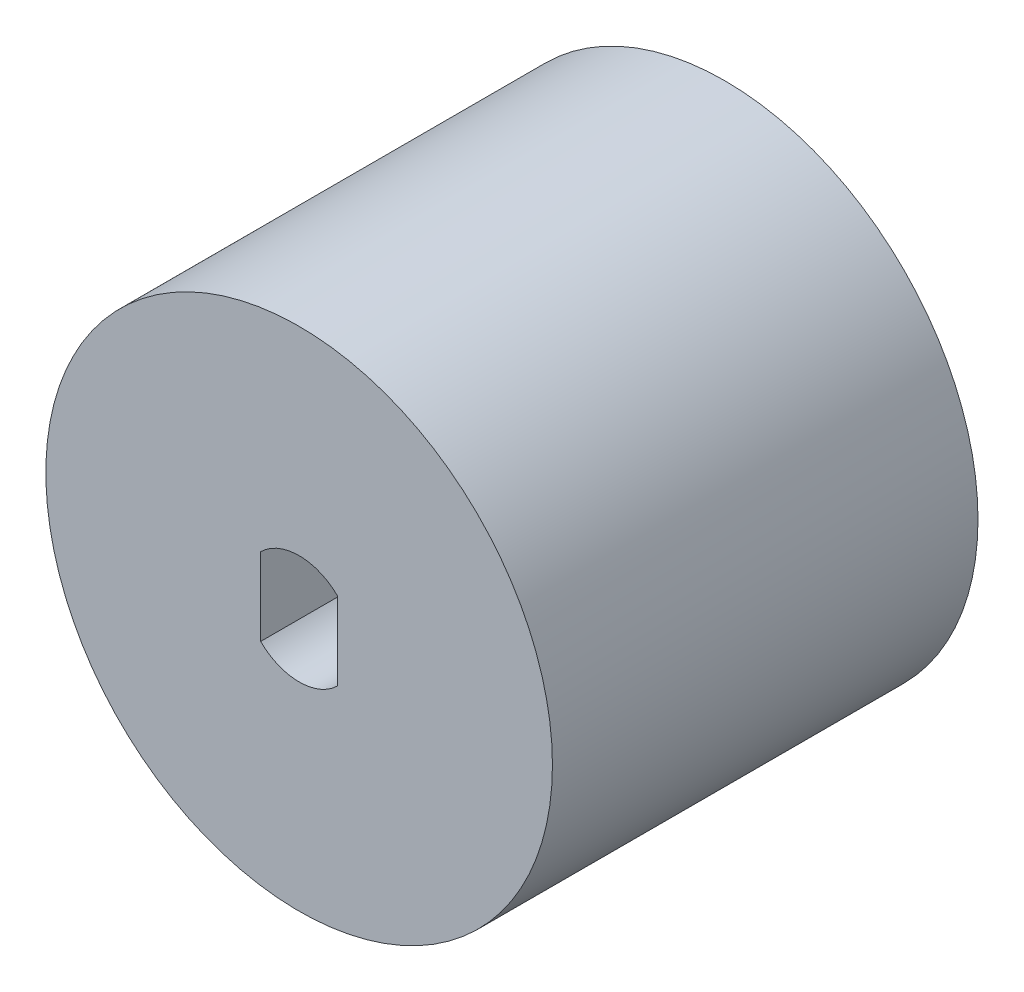
ISO-10303-21;
HEADER;
FILE_DESCRIPTION(('STEP AP214'),'2;1');
FILE_NAME('part.step','',(''),(''),'','','');
FILE_SCHEMA(('AUTOMOTIVE_DESIGN { 1 0 10303 214 1 1 1 1 }'));
ENDSEC;
DATA;
#1=APPLICATION_CONTEXT('core data for automotive mechanical design processes');
#2=APPLICATION_PROTOCOL_DEFINITION('international standard','automotive_design',2000,#1);
#3=PRODUCT_CONTEXT('',#1,'mechanical');
#4=PRODUCT('Part','Part','',(#3));
#5=PRODUCT_RELATED_PRODUCT_CATEGORY('part','',(#4));
#6=PRODUCT_DEFINITION_FORMATION('','',#4);
#7=PRODUCT_DEFINITION_CONTEXT('part definition',#1,'design');
#8=PRODUCT_DEFINITION('design','',#6,#7);
#9=PRODUCT_DEFINITION_SHAPE('','',#8);
#10=(LENGTH_UNIT() NAMED_UNIT(*) SI_UNIT(.MILLI.,.METRE.));
#11=(NAMED_UNIT(*) PLANE_ANGLE_UNIT() SI_UNIT($,.RADIAN.));
#12=(NAMED_UNIT(*) SI_UNIT($,.STERADIAN.) SOLID_ANGLE_UNIT());
#13=UNCERTAINTY_MEASURE_WITH_UNIT(LENGTH_MEASURE(1.E-05),#10,'distance_accuracy_value','');
#14=(GEOMETRIC_REPRESENTATION_CONTEXT(3) GLOBAL_UNCERTAINTY_ASSIGNED_CONTEXT((#13)) GLOBAL_UNIT_ASSIGNED_CONTEXT((#10,
#11,#12)) REPRESENTATION_CONTEXT('',''));
#15=CARTESIAN_POINT('',(0.,0.,0.));
#16=DIRECTION('',(0.,0.,1.));
#17=DIRECTION('',(1.,0.,0.));
#18=AXIS2_PLACEMENT_3D('',#15,#16,#17);
#19=CARTESIAN_POINT('',(0.,0.,-6.));
#20=DIRECTION('',(0.,0.,-1.));
#21=DIRECTION('',(-1.,0.,0.));
#22=AXIS2_PLACEMENT_3D('',#19,#20,#21);
#23=PLANE('',#22);
#24=CARTESIAN_POINT('',(0.,0.,-6.));
#25=DIRECTION('',(0.,0.,-1.));
#26=DIRECTION('',(-1.,0.,0.));
#27=AXIS2_PLACEMENT_3D('',#24,#25,#26);
#28=CIRCLE('',#27,1.);
#29=CARTESIAN_POINT('',(-1.,0.,-6.));
#30=VERTEX_POINT('',#29);
#31=EDGE_CURVE('E134',#30,#30,#28,.T.);
#32=ORIENTED_EDGE('',*,*,#31,.F.);
#33=EDGE_LOOP('',(#32));
#34=FACE_BOUND('',#33,.T.);
#35=CARTESIAN_POINT('',(0.,0.,-6.));
#36=DIRECTION('',(0.,0.,-1.));
#37=DIRECTION('',(-1.,0.,0.));
#38=AXIS2_PLACEMENT_3D('',#35,#36,#37);
#39=CIRCLE('',#38,7.5);
#40=CARTESIAN_POINT('',(-7.5,0.,-6.));
#41=VERTEX_POINT('',#40);
#42=EDGE_CURVE('E258',#41,#41,#39,.T.);
#43=ORIENTED_EDGE('',*,*,#42,.T.);
#44=EDGE_LOOP('',(#43));
#45=FACE_BOUND('',#44,.T.);
#46=ADVANCED_FACE('F60',(#34,#45),#23,.T.);
#47=CARTESIAN_POINT('',(0.,0.,0.));
#48=DIRECTION('',(0.,0.,1.));
#49=DIRECTION('',(1.,0.,0.));
#50=AXIS2_PLACEMENT_3D('',#47,#48,#49);
#51=PLANE('',#50);
#52=CARTESIAN_POINT('',(0.,0.,0.));
#53=DIRECTION('',(0.,0.,1.));
#54=DIRECTION('',(1.,0.,0.));
#55=AXIS2_PLACEMENT_3D('',#52,#53,#54);
#56=CIRCLE('',#55,2.7);
#57=CARTESIAN_POINT('',(-1.9,-1.91833260932509,0.));
#58=VERTEX_POINT('',#57);
#59=CARTESIAN_POINT('',(1.9,-1.91833260932509,0.));
#60=VERTEX_POINT('',#59);
#61=EDGE_CURVE('E85',#58,#60,#56,.T.);
#62=ORIENTED_EDGE('',*,*,#61,.F.);
#63=DIRECTION('',(0.,1.,0.));
#64=VECTOR('',#63,1.);
#65=CARTESIAN_POINT('',(-1.9,-1.91833260932509,0.));
#66=LINE('',#65,#64);
#67=CARTESIAN_POINT('',(-1.9,1.91833260932509,0.));
#68=VERTEX_POINT('',#67);
#69=EDGE_CURVE('E140',#58,#68,#66,.T.);
#70=ORIENTED_EDGE('',*,*,#69,.T.);
#71=CARTESIAN_POINT('',(0.,0.,0.));
#72=DIRECTION('',(0.,0.,1.));
#73=DIRECTION('',(1.,0.,0.));
#74=AXIS2_PLACEMENT_3D('',#71,#72,#73);
#75=CIRCLE('',#74,2.7);
#76=CARTESIAN_POINT('',(1.9,1.91833260932509,0.));
#77=VERTEX_POINT('',#76);
#78=EDGE_CURVE('E104',#77,#68,#75,.T.);
#79=ORIENTED_EDGE('',*,*,#78,.F.);
#80=DIRECTION('',(0.,1.,0.));
#81=VECTOR('',#80,1.);
#82=CARTESIAN_POINT('',(1.9,-1.91833260932509,0.));
#83=LINE('',#82,#81);
#84=EDGE_CURVE('E133',#60,#77,#83,.T.);
#85=ORIENTED_EDGE('',*,*,#84,.F.);
#86=EDGE_LOOP('',(#62,#70,#79,#85));
#87=FACE_BOUND('',#86,.T.);
#88=CARTESIAN_POINT('',(0.,0.,0.));
#89=DIRECTION('',(0.,0.,1.));
#90=DIRECTION('',(1.,0.,0.));
#91=AXIS2_PLACEMENT_3D('',#88,#89,#90);
#92=CIRCLE('',#91,12.5);
#93=CARTESIAN_POINT('',(12.5,0.,0.));
#94=VERTEX_POINT('',#93);
#95=EDGE_CURVE('E153',#94,#94,#92,.T.);
#96=ORIENTED_EDGE('',*,*,#95,.T.);
#97=EDGE_LOOP('',(#96));
#98=FACE_BOUND('',#97,.T.);
#99=ADVANCED_FACE('F62',(#87,#98),#51,.T.);
#100=CARTESIAN_POINT('',(0.,0.,-4.));
#101=DIRECTION('',(0.,0.,1.));
#102=DIRECTION('',(1.,0.,0.));
#103=AXIS2_PLACEMENT_3D('',#100,#101,#102);
#104=CYLINDRICAL_SURFACE('',#103,2.7);
#105=ORIENTED_EDGE('',*,*,#61,.T.);
#106=DIRECTION('',(0.,0.,1.));
#107=VECTOR('',#106,1.);
#108=CARTESIAN_POINT('',(1.9,-1.91833260932509,-4.));
#109=LINE('',#108,#107);
#110=CARTESIAN_POINT('',(1.9,-1.91833260932509,-4.));
#111=VERTEX_POINT('',#110);
#112=EDGE_CURVE('E64',#111,#60,#109,.T.);
#113=ORIENTED_EDGE('',*,*,#112,.F.);
#114=CARTESIAN_POINT('',(0.,0.,-4.));
#115=DIRECTION('',(0.,0.,1.));
#116=DIRECTION('',(1.,0.,0.));
#117=AXIS2_PLACEMENT_3D('',#114,#115,#116);
#118=CIRCLE('',#117,2.7);
#119=CARTESIAN_POINT('',(-1.9,-1.91833260932509,-4.));
#120=VERTEX_POINT('',#119);
#121=EDGE_CURVE('E127',#120,#111,#118,.T.);
#122=ORIENTED_EDGE('',*,*,#121,.F.);
#123=DIRECTION('',(0.,0.,1.));
#124=VECTOR('',#123,1.);
#125=CARTESIAN_POINT('',(-1.9,-1.91833260932509,-4.));
#126=LINE('',#125,#124);
#127=EDGE_CURVE('E12',#120,#58,#126,.T.);
#128=ORIENTED_EDGE('',*,*,#127,.T.);
#129=EDGE_LOOP('',(#105,#113,#122,#128));
#130=FACE_BOUND('',#129,.T.);
#131=ADVANCED_FACE('F150',(#130),#104,.F.);
#132=CARTESIAN_POINT('',(-1.9,-1.91833260932509,-4.));
#133=DIRECTION('',(1.,0.,0.));
#134=DIRECTION('',(0.,0.,-1.));
#135=AXIS2_PLACEMENT_3D('',#132,#133,#134);
#136=PLANE('',#135);
#137=ORIENTED_EDGE('',*,*,#69,.F.);
#138=ORIENTED_EDGE('',*,*,#127,.F.);
#139=DIRECTION('',(0.,1.,0.));
#140=VECTOR('',#139,1.);
#141=CARTESIAN_POINT('',(-1.9,-1.91833260932509,-4.));
#142=LINE('',#141,#140);
#143=CARTESIAN_POINT('',(-1.9,1.91833260932509,-4.));
#144=VERTEX_POINT('',#143);
#145=EDGE_CURVE('E112',#120,#144,#142,.T.);
#146=ORIENTED_EDGE('',*,*,#145,.T.);
#147=DIRECTION('',(0.,0.,1.));
#148=VECTOR('',#147,1.);
#149=CARTESIAN_POINT('',(-1.9,1.91833260932509,-4.));
#150=LINE('',#149,#148);
#151=EDGE_CURVE('E70',#144,#68,#150,.T.);
#152=ORIENTED_EDGE('',*,*,#151,.T.);
#153=EDGE_LOOP('',(#137,#138,#146,#152));
#154=FACE_BOUND('',#153,.T.);
#155=ADVANCED_FACE('F113',(#154),#136,.T.);
#156=CARTESIAN_POINT('',(0.,0.,-4.));
#157=DIRECTION('',(0.,0.,1.));
#158=DIRECTION('',(1.,0.,0.));
#159=AXIS2_PLACEMENT_3D('',#156,#157,#158);
#160=CYLINDRICAL_SURFACE('',#159,2.7);
#161=ORIENTED_EDGE('',*,*,#78,.T.);
#162=ORIENTED_EDGE('',*,*,#151,.F.);
#163=CARTESIAN_POINT('',(0.,0.,-4.));
#164=DIRECTION('',(0.,0.,1.));
#165=DIRECTION('',(1.,0.,0.));
#166=AXIS2_PLACEMENT_3D('',#163,#164,#165);
#167=CIRCLE('',#166,2.7);
#168=CARTESIAN_POINT('',(1.9,1.91833260932509,-4.));
#169=VERTEX_POINT('',#168);
#170=EDGE_CURVE('E78',#169,#144,#167,.T.);
#171=ORIENTED_EDGE('',*,*,#170,.F.);
#172=DIRECTION('',(0.,0.,1.));
#173=VECTOR('',#172,1.);
#174=CARTESIAN_POINT('',(1.9,1.91833260932509,-4.));
#175=LINE('',#174,#173);
#176=EDGE_CURVE('E109',#169,#77,#175,.T.);
#177=ORIENTED_EDGE('',*,*,#176,.T.);
#178=EDGE_LOOP('',(#161,#162,#171,#177));
#179=FACE_BOUND('',#178,.T.);
#180=ADVANCED_FACE('F102',(#179),#160,.F.);
#181=CARTESIAN_POINT('',(1.9,-1.91833260932509,-4.));
#182=DIRECTION('',(1.,0.,0.));
#183=DIRECTION('',(0.,0.,-1.));
#184=AXIS2_PLACEMENT_3D('',#181,#182,#183);
#185=PLANE('',#184);
#186=ORIENTED_EDGE('',*,*,#84,.T.);
#187=ORIENTED_EDGE('',*,*,#176,.F.);
#188=DIRECTION('',(0.,1.,0.));
#189=VECTOR('',#188,1.);
#190=CARTESIAN_POINT('',(1.9,-1.91833260932509,-4.));
#191=LINE('',#190,#189);
#192=EDGE_CURVE('E123',#111,#169,#191,.T.);
#193=ORIENTED_EDGE('',*,*,#192,.F.);
#194=ORIENTED_EDGE('',*,*,#112,.T.);
#195=EDGE_LOOP('',(#186,#187,#193,#194));
#196=FACE_BOUND('',#195,.T.);
#197=ADVANCED_FACE('F146',(#196),#185,.F.);
#198=CARTESIAN_POINT('',(0.,0.,-4.));
#199=DIRECTION('',(0.,0.,-1.));
#200=DIRECTION('',(-1.,0.,0.));
#201=AXIS2_PLACEMENT_3D('',#198,#199,#200);
#202=PLANE('',#201);
#203=ORIENTED_EDGE('',*,*,#145,.F.);
#204=ORIENTED_EDGE('',*,*,#121,.T.);
#205=ORIENTED_EDGE('',*,*,#192,.T.);
#206=ORIENTED_EDGE('',*,*,#170,.T.);
#207=EDGE_LOOP('',(#203,#204,#205,#206));
#208=FACE_BOUND('',#207,.T.);
#209=CARTESIAN_POINT('',(0.,0.,-4.));
#210=DIRECTION('',(0.,0.,-1.));
#211=DIRECTION('',(-1.,0.,0.));
#212=AXIS2_PLACEMENT_3D('',#209,#210,#211);
#213=CIRCLE('',#212,1.);
#214=CARTESIAN_POINT('',(-1.,0.,-4.));
#215=VERTEX_POINT('',#214);
#216=EDGE_CURVE('E156',#215,#215,#213,.T.);
#217=ORIENTED_EDGE('',*,*,#216,.T.);
#218=EDGE_LOOP('',(#217));
#219=FACE_BOUND('',#218,.T.);
#220=ADVANCED_FACE('F120',(#208,#219),#202,.F.);
#221=CARTESIAN_POINT('',(0.,0.,-6.));
#222=DIRECTION('',(0.,0.,1.));
#223=DIRECTION('',(1.,0.,0.));
#224=AXIS2_PLACEMENT_3D('',#221,#222,#223);
#225=CYLINDRICAL_SURFACE('',#224,1.);
#226=ORIENTED_EDGE('',*,*,#31,.T.);
#227=EDGE_LOOP('',(#226));
#228=FACE_BOUND('',#227,.T.);
#229=ORIENTED_EDGE('',*,*,#216,.F.);
#230=EDGE_LOOP('',(#229));
#231=FACE_BOUND('',#230,.T.);
#232=ADVANCED_FACE('F187',(#228,#231),#225,.F.);
#233=CARTESIAN_POINT('',(0.,0.,-6.));
#234=DIRECTION('',(0.,0.,1.));
#235=DIRECTION('',(1.,0.,0.));
#236=AXIS2_PLACEMENT_3D('',#233,#234,#235);
#237=CYLINDRICAL_SURFACE('',#236,12.5);
#238=ORIENTED_EDGE('',*,*,#95,.F.);
#239=EDGE_LOOP('',(#238));
#240=FACE_BOUND('',#239,.T.);
#241=CARTESIAN_POINT('',(0.,0.,-21.));
#242=DIRECTION('',(0.,0.,-1.));
#243=DIRECTION('',(-1.,0.,0.));
#244=AXIS2_PLACEMENT_3D('',#241,#242,#243);
#245=CIRCLE('',#244,12.5);
#246=CARTESIAN_POINT('',(-12.5,0.,-21.));
#247=VERTEX_POINT('',#246);
#248=EDGE_CURVE('E157',#247,#247,#245,.T.);
#249=ORIENTED_EDGE('',*,*,#248,.F.);
#250=EDGE_LOOP('',(#249));
#251=FACE_BOUND('',#250,.T.);
#252=ADVANCED_FACE('F208',(#240,#251),#237,.T.);
#253=CARTESIAN_POINT('',(0.,0.,-21.));
#254=DIRECTION('',(0.,0.,-1.));
#255=DIRECTION('',(-1.,0.,0.));
#256=AXIS2_PLACEMENT_3D('',#253,#254,#255);
#257=PLANE('',#256);
#258=ORIENTED_EDGE('',*,*,#248,.T.);
#259=EDGE_LOOP('',(#258));
#260=FACE_BOUND('',#259,.T.);
#261=CARTESIAN_POINT('',(0.,0.,-21.));
#262=DIRECTION('',(0.,0.,-1.));
#263=DIRECTION('',(-1.,0.,0.));
#264=AXIS2_PLACEMENT_3D('',#261,#262,#263);
#265=CIRCLE('',#264,7.5);
#266=CARTESIAN_POINT('',(-7.5,0.,-21.));
#267=VERTEX_POINT('',#266);
#268=EDGE_CURVE('E164',#267,#267,#265,.T.);
#269=ORIENTED_EDGE('',*,*,#268,.F.);
#270=EDGE_LOOP('',(#269));
#271=FACE_BOUND('',#270,.T.);
#272=ADVANCED_FACE('F224',(#260,#271),#257,.T.);
#273=CARTESIAN_POINT('',(0.,0.,-21.));
#274=DIRECTION('',(0.,0.,1.));
#275=DIRECTION('',(1.,0.,0.));
#276=AXIS2_PLACEMENT_3D('',#273,#274,#275);
#277=CYLINDRICAL_SURFACE('',#276,7.5);
#278=ORIENTED_EDGE('',*,*,#268,.T.);
#279=EDGE_LOOP('',(#278));
#280=FACE_BOUND('',#279,.T.);
#281=ORIENTED_EDGE('',*,*,#42,.F.);
#282=EDGE_LOOP('',(#281));
#283=FACE_BOUND('',#282,.T.);
#284=ADVANCED_FACE('F236',(#280,#283),#277,.F.);
#285=CLOSED_SHELL('',(#46,#99,#131,#155,#180,#197,#220,#232,#252,#272,#284));
#286=MANIFOLD_SOLID_BREP('B2',#285);
#287=ADVANCED_BREP_SHAPE_REPRESENTATION('',(#18,#286),#14);
#288=SHAPE_DEFINITION_REPRESENTATION(#9,#287);
ENDSEC;
END-ISO-10303-21;
